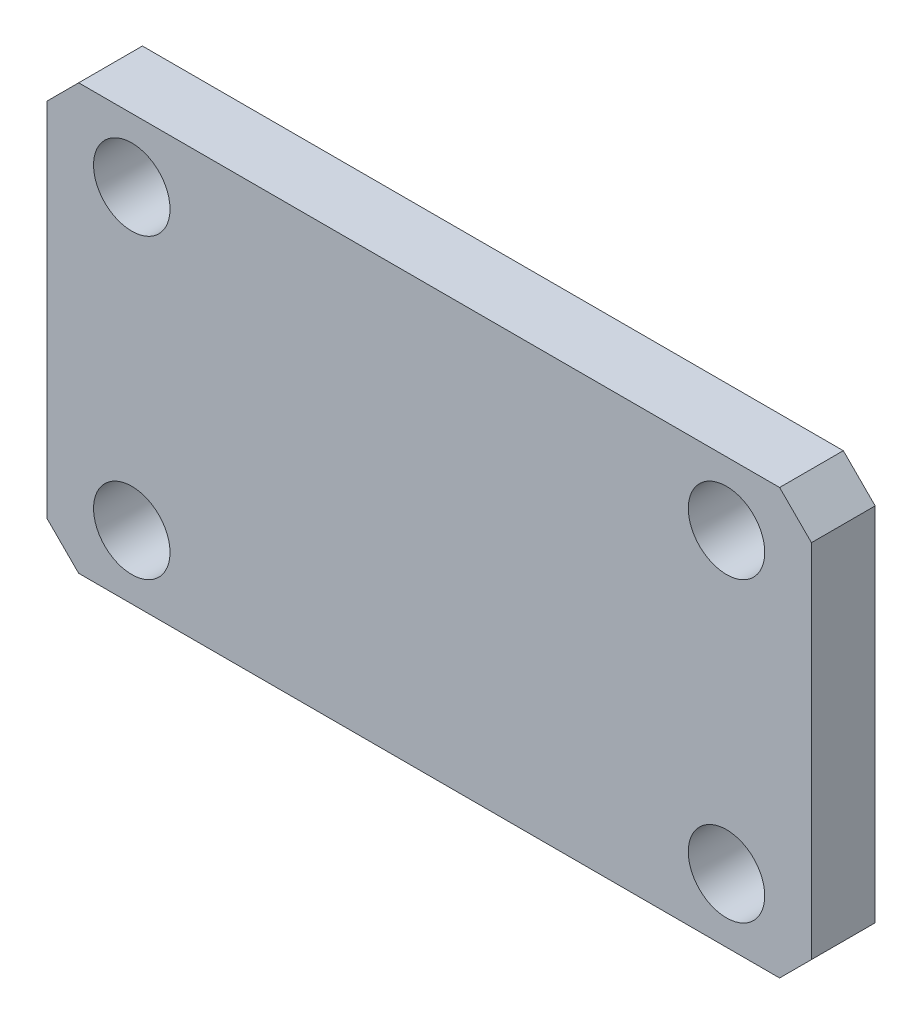
ISO-10303-21;
HEADER;
FILE_DESCRIPTION(('STEP AP214'),'2;1');
FILE_NAME('part.step','',(''),(''),'','','');
FILE_SCHEMA(('AUTOMOTIVE_DESIGN { 1 0 10303 214 1 1 1 1 }'));
ENDSEC;
DATA;
#1=APPLICATION_CONTEXT('core data for automotive mechanical design processes');
#2=APPLICATION_PROTOCOL_DEFINITION('international standard','automotive_design',2000,#1);
#3=PRODUCT_CONTEXT('',#1,'mechanical');
#4=PRODUCT('Part','Part','',(#3));
#5=PRODUCT_RELATED_PRODUCT_CATEGORY('part','',(#4));
#6=PRODUCT_DEFINITION_FORMATION('','',#4);
#7=PRODUCT_DEFINITION_CONTEXT('part definition',#1,'design');
#8=PRODUCT_DEFINITION('design','',#6,#7);
#9=PRODUCT_DEFINITION_SHAPE('','',#8);
#10=(LENGTH_UNIT() NAMED_UNIT(*) SI_UNIT(.MILLI.,.METRE.));
#11=(NAMED_UNIT(*) PLANE_ANGLE_UNIT() SI_UNIT($,.RADIAN.));
#12=(NAMED_UNIT(*) SI_UNIT($,.STERADIAN.) SOLID_ANGLE_UNIT());
#13=UNCERTAINTY_MEASURE_WITH_UNIT(LENGTH_MEASURE(1.E-05),#10,'distance_accuracy_value','');
#14=(GEOMETRIC_REPRESENTATION_CONTEXT(3) GLOBAL_UNCERTAINTY_ASSIGNED_CONTEXT((#13)) GLOBAL_UNIT_ASSIGNED_CONTEXT((#10,
#11,#12)) REPRESENTATION_CONTEXT('',''));
#15=CARTESIAN_POINT('',(0.,0.,0.));
#16=DIRECTION('',(0.,0.,1.));
#17=DIRECTION('',(1.,0.,0.));
#18=AXIS2_PLACEMENT_3D('',#15,#16,#17);
#19=CARTESIAN_POINT('',(27.,0.,-0.5));
#20=DIRECTION('',(-1.,0.,0.));
#21=DIRECTION('',(0.,0.,1.));
#22=AXIS2_PLACEMENT_3D('',#19,#20,#21);
#23=PLANE('',#22);
#24=DIRECTION('',(0.,-1.,0.));
#25=VECTOR('',#24,1.);
#26=CARTESIAN_POINT('',(27.,0.,0.5));
#27=LINE('',#26,#25);
#28=CARTESIAN_POINT('',(27.,15.,0.5));
#29=VERTEX_POINT('',#28);
#30=CARTESIAN_POINT('',(27.,5.,0.5));
#31=VERTEX_POINT('',#30);
#32=EDGE_CURVE('E116',#29,#31,#27,.T.);
#33=ORIENTED_EDGE('',*,*,#32,.T.);
#34=DIRECTION('',(0.,0.,1.));
#35=VECTOR('',#34,1.);
#36=CARTESIAN_POINT('',(27.,5.,-0.5));
#37=LINE('',#36,#35);
#38=CARTESIAN_POINT('',(27.,5.,-0.5));
#39=VERTEX_POINT('',#38);
#40=EDGE_CURVE('E12',#39,#31,#37,.T.);
#41=ORIENTED_EDGE('',*,*,#40,.F.);
#42=DIRECTION('',(0.,-1.,0.));
#43=VECTOR('',#42,1.);
#44=CARTESIAN_POINT('',(27.,0.,-0.5));
#45=LINE('',#44,#43);
#46=CARTESIAN_POINT('',(27.,15.,-0.5));
#47=VERTEX_POINT('',#46);
#48=EDGE_CURVE('E104',#47,#39,#45,.T.);
#49=ORIENTED_EDGE('',*,*,#48,.F.);
#50=DIRECTION('',(0.,0.,1.));
#51=VECTOR('',#50,1.);
#52=CARTESIAN_POINT('',(27.,15.,-0.5));
#53=LINE('',#52,#51);
#54=EDGE_CURVE('E112',#47,#29,#53,.T.);
#55=ORIENTED_EDGE('',*,*,#54,.T.);
#56=EDGE_LOOP('',(#33,#41,#49,#55));
#57=FACE_BOUND('',#56,.T.);
#58=ADVANCED_FACE('F53',(#57),#23,.F.);
#59=CARTESIAN_POINT('',(0.,5.,-0.5));
#60=DIRECTION('',(0.,1.,0.));
#61=DIRECTION('',(0.,0.,1.));
#62=AXIS2_PLACEMENT_3D('',#59,#60,#61);
#63=PLANE('',#62);
#64=DIRECTION('',(-1.,0.,0.));
#65=VECTOR('',#64,1.);
#66=CARTESIAN_POINT('',(0.,5.,0.5));
#67=LINE('',#66,#65);
#68=CARTESIAN_POINT('',(9.00000000000001,5.,0.5));
#69=VERTEX_POINT('',#68);
#70=EDGE_CURVE('E108',#31,#69,#67,.T.);
#71=ORIENTED_EDGE('',*,*,#70,.T.);
#72=DIRECTION('',(0.,0.,1.));
#73=VECTOR('',#72,1.);
#74=CARTESIAN_POINT('',(9.00000000000001,5.,-0.5));
#75=LINE('',#74,#73);
#76=CARTESIAN_POINT('',(9.00000000000001,5.,-0.5));
#77=VERTEX_POINT('',#76);
#78=EDGE_CURVE('E61',#77,#69,#75,.T.);
#79=ORIENTED_EDGE('',*,*,#78,.F.);
#80=DIRECTION('',(-1.,0.,0.));
#81=VECTOR('',#80,1.);
#82=CARTESIAN_POINT('',(0.,5.,-0.5));
#83=LINE('',#82,#81);
#84=EDGE_CURVE('E99',#39,#77,#83,.T.);
#85=ORIENTED_EDGE('',*,*,#84,.F.);
#86=ORIENTED_EDGE('',*,*,#40,.T.);
#87=EDGE_LOOP('',(#71,#79,#85,#86));
#88=FACE_BOUND('',#87,.T.);
#89=ADVANCED_FACE('F107',(#88),#63,.F.);
#90=CARTESIAN_POINT('',(9.00000000000001,0.,-0.5));
#91=DIRECTION('',(1.,0.,0.));
#92=DIRECTION('',(0.,0.,-1.));
#93=AXIS2_PLACEMENT_3D('',#90,#91,#92);
#94=PLANE('',#93);
#95=DIRECTION('',(0.,1.,0.));
#96=VECTOR('',#95,1.);
#97=CARTESIAN_POINT('',(9.00000000000001,0.,0.5));
#98=LINE('',#97,#96);
#99=CARTESIAN_POINT('',(9.00000000000001,15.,0.5));
#100=VERTEX_POINT('',#99);
#101=EDGE_CURVE('E86',#69,#100,#98,.T.);
#102=ORIENTED_EDGE('',*,*,#101,.T.);
#103=DIRECTION('',(0.,0.,1.));
#104=VECTOR('',#103,1.);
#105=CARTESIAN_POINT('',(9.00000000000001,15.,-0.5));
#106=LINE('',#105,#104);
#107=CARTESIAN_POINT('',(9.00000000000001,15.,-0.5));
#108=VERTEX_POINT('',#107);
#109=EDGE_CURVE('E109',#108,#100,#106,.T.);
#110=ORIENTED_EDGE('',*,*,#109,.F.);
#111=DIRECTION('',(0.,1.,0.));
#112=VECTOR('',#111,1.);
#113=CARTESIAN_POINT('',(9.00000000000001,0.,-0.5));
#114=LINE('',#113,#112);
#115=EDGE_CURVE('E102',#77,#108,#114,.T.);
#116=ORIENTED_EDGE('',*,*,#115,.F.);
#117=ORIENTED_EDGE('',*,*,#78,.T.);
#118=EDGE_LOOP('',(#102,#110,#116,#117));
#119=FACE_BOUND('',#118,.T.);
#120=ADVANCED_FACE('F110',(#119),#94,.F.);
#121=CARTESIAN_POINT('',(0.,15.,-0.5));
#122=DIRECTION('',(0.,-1.,0.));
#123=DIRECTION('',(0.,0.,-1.));
#124=AXIS2_PLACEMENT_3D('',#121,#122,#123);
#125=PLANE('',#124);
#126=DIRECTION('',(1.,0.,0.));
#127=VECTOR('',#126,1.);
#128=CARTESIAN_POINT('',(0.,15.,0.5));
#129=LINE('',#128,#127);
#130=EDGE_CURVE('E92',#100,#29,#129,.T.);
#131=ORIENTED_EDGE('',*,*,#130,.T.);
#132=ORIENTED_EDGE('',*,*,#54,.F.);
#133=DIRECTION('',(1.,0.,0.));
#134=VECTOR('',#133,1.);
#135=CARTESIAN_POINT('',(0.,15.,-0.5));
#136=LINE('',#135,#134);
#137=EDGE_CURVE('E69',#108,#47,#136,.T.);
#138=ORIENTED_EDGE('',*,*,#137,.F.);
#139=ORIENTED_EDGE('',*,*,#109,.T.);
#140=EDGE_LOOP('',(#131,#132,#138,#139));
#141=FACE_BOUND('',#140,.T.);
#142=ADVANCED_FACE('F123',(#141),#125,.F.);
#143=CARTESIAN_POINT('',(0.,0.,-0.5));
#144=DIRECTION('',(0.,0.,-1.));
#145=DIRECTION('',(-1.,0.,0.));
#146=AXIS2_PLACEMENT_3D('',#143,#144,#145);
#147=PLANE('',#146);
#148=ORIENTED_EDGE('',*,*,#48,.T.);
#149=ORIENTED_EDGE('',*,*,#84,.T.);
#150=ORIENTED_EDGE('',*,*,#115,.T.);
#151=ORIENTED_EDGE('',*,*,#137,.T.);
#152=EDGE_LOOP('',(#148,#149,#150,#151));
#153=FACE_BOUND('',#152,.T.);
#154=ADVANCED_FACE('F100',(#153),#147,.T.);
#155=CARTESIAN_POINT('',(0.,0.,0.5));
#156=DIRECTION('',(0.,0.,-1.));
#157=DIRECTION('',(-1.,0.,0.));
#158=AXIS2_PLACEMENT_3D('',#155,#156,#157);
#159=PLANE('',#158);
#160=ORIENTED_EDGE('',*,*,#32,.F.);
#161=ORIENTED_EDGE('',*,*,#130,.F.);
#162=ORIENTED_EDGE('',*,*,#101,.F.);
#163=ORIENTED_EDGE('',*,*,#70,.F.);
#164=EDGE_LOOP('',(#160,#161,#162,#163));
#165=FACE_BOUND('',#164,.T.);
#166=ADVANCED_FACE('F126',(#165),#159,.F.);
#167=CLOSED_SHELL('',(#58,#89,#120,#142,#154,#166));
#168=MANIFOLD_SOLID_BREP('B2',#167);
#169=CARTESIAN_POINT('',(0.,0.,0.));
#170=DIRECTION('',(0.,0.,-1.));
#171=DIRECTION('',(-1.,0.,0.));
#172=AXIS2_PLACEMENT_3D('',#169,#170,#171);
#173=PLANE('',#172);
#174=CARTESIAN_POINT('',(3.99999999999993,17.,0.));
#175=DIRECTION('',(0.,0.,-1.));
#176=DIRECTION('',(-1.,0.,0.));
#177=AXIS2_PLACEMENT_3D('',#174,#175,#176);
#178=CIRCLE('',#177,1.8);
#179=CARTESIAN_POINT('',(2.19999999999993,17.,0.));
#180=VERTEX_POINT('',#179);
#181=EDGE_CURVE('E280',#180,#180,#178,.T.);
#182=ORIENTED_EDGE('',*,*,#181,.F.);
#183=EDGE_LOOP('',(#182));
#184=FACE_BOUND('',#183,.T.);
#185=CARTESIAN_POINT('',(31.9999999999999,17.,0.));
#186=DIRECTION('',(0.,0.,-1.));
#187=DIRECTION('',(-1.,0.,0.));
#188=AXIS2_PLACEMENT_3D('',#185,#186,#187);
#189=CIRCLE('',#188,1.8);
#190=CARTESIAN_POINT('',(30.1999999999999,17.,0.));
#191=VERTEX_POINT('',#190);
#192=EDGE_CURVE('E289',#191,#191,#189,.T.);
#193=ORIENTED_EDGE('',*,*,#192,.F.);
#194=EDGE_LOOP('',(#193));
#195=FACE_BOUND('',#194,.T.);
#196=CARTESIAN_POINT('',(32.0000000000001,3.,0.));
#197=DIRECTION('',(0.,0.,-1.));
#198=DIRECTION('',(-1.,0.,0.));
#199=AXIS2_PLACEMENT_3D('',#196,#197,#198);
#200=CIRCLE('',#199,1.8);
#201=CARTESIAN_POINT('',(30.2000000000001,3.,0.));
#202=VERTEX_POINT('',#201);
#203=EDGE_CURVE('E295',#202,#202,#200,.T.);
#204=ORIENTED_EDGE('',*,*,#203,.F.);
#205=EDGE_LOOP('',(#204));
#206=FACE_BOUND('',#205,.T.);
#207=CARTESIAN_POINT('',(4.00000000000007,3.,0.));
#208=DIRECTION('',(0.,0.,-1.));
#209=DIRECTION('',(-1.,0.,0.));
#210=AXIS2_PLACEMENT_3D('',#207,#208,#209);
#211=CIRCLE('',#210,1.8);
#212=CARTESIAN_POINT('',(2.20000000000007,3.,0.));
#213=VERTEX_POINT('',#212);
#214=EDGE_CURVE('E299',#213,#213,#211,.T.);
#215=ORIENTED_EDGE('',*,*,#214,.F.);
#216=EDGE_LOOP('',(#215));
#217=FACE_BOUND('',#216,.T.);
#218=DIRECTION('',(-1.,0.,0.));
#219=VECTOR('',#218,1.);
#220=CARTESIAN_POINT('',(0.,20.,0.));
#221=LINE('',#220,#219);
#222=CARTESIAN_POINT('',(34.5,20.,0.));
#223=VERTEX_POINT('',#222);
#224=CARTESIAN_POINT('',(1.50000000000001,20.,0.));
#225=VERTEX_POINT('',#224);
#226=EDGE_CURVE('E307',#223,#225,#221,.T.);
#227=ORIENTED_EDGE('',*,*,#226,.F.);
#228=DIRECTION('',(-0.707106781186544,0.707106781186551,0.));
#229=VECTOR('',#228,1.);
#230=CARTESIAN_POINT('',(27.2500000000002,27.2499999999999,0.));
#231=LINE('',#230,#229);
#232=CARTESIAN_POINT('',(36.,18.5,0.));
#233=VERTEX_POINT('',#232);
#234=EDGE_CURVE('E339',#223,#233,#231,.F.);
#235=ORIENTED_EDGE('',*,*,#234,.T.);
#236=DIRECTION('',(0.,1.,0.));
#237=VECTOR('',#236,1.);
#238=CARTESIAN_POINT('',(36.,0.,0.));
#239=LINE('',#238,#237);
#240=CARTESIAN_POINT('',(36.,1.5,0.));
#241=VERTEX_POINT('',#240);
#242=EDGE_CURVE('E320',#241,#233,#239,.T.);
#243=ORIENTED_EDGE('',*,*,#242,.F.);
#244=DIRECTION('',(0.707106781186548,0.707106781186548,0.));
#245=VECTOR('',#244,1.);
#246=CARTESIAN_POINT('',(17.25,-17.25,0.));
#247=LINE('',#246,#245);
#248=CARTESIAN_POINT('',(34.5,0.,0.));
#249=VERTEX_POINT('',#248);
#250=EDGE_CURVE('E337',#241,#249,#247,.F.);
#251=ORIENTED_EDGE('',*,*,#250,.T.);
#252=DIRECTION('',(1.,0.,0.));
#253=VECTOR('',#252,1.);
#254=CARTESIAN_POINT('',(0.,0.,0.));
#255=LINE('',#254,#253);
#256=CARTESIAN_POINT('',(1.5,0.,0.));
#257=VERTEX_POINT('',#256);
#258=EDGE_CURVE('E318',#257,#249,#255,.T.);
#259=ORIENTED_EDGE('',*,*,#258,.F.);
#260=DIRECTION('',(0.707106781186547,-0.707106781186548,0.));
#261=VECTOR('',#260,1.);
#262=CARTESIAN_POINT('',(0.750000000000002,0.750000000000001,0.));
#263=LINE('',#262,#261);
#264=CARTESIAN_POINT('',(0.,1.5,0.));
#265=VERTEX_POINT('',#264);
#266=EDGE_CURVE('E335',#257,#265,#263,.F.);
#267=ORIENTED_EDGE('',*,*,#266,.T.);
#268=DIRECTION('',(0.,-1.,0.));
#269=VECTOR('',#268,1.);
#270=CARTESIAN_POINT('',(0.,0.,0.));
#271=LINE('',#270,#269);
#272=CARTESIAN_POINT('',(0.,18.5,0.));
#273=VERTEX_POINT('',#272);
#274=EDGE_CURVE('E302',#273,#265,#271,.T.);
#275=ORIENTED_EDGE('',*,*,#274,.F.);
#276=DIRECTION('',(-0.70710678118655,-0.707106781186545,0.));
#277=VECTOR('',#276,1.);
#278=CARTESIAN_POINT('',(-9.25,9.25000000000006,0.));
#279=LINE('',#278,#277);
#280=EDGE_CURVE('E333',#273,#225,#279,.F.);
#281=ORIENTED_EDGE('',*,*,#280,.T.);
#282=EDGE_LOOP('',(#227,#235,#243,#251,#259,#267,#275,#281));
#283=FACE_BOUND('',#282,.T.);
#284=DIRECTION('',(-1.,0.,0.));
#285=VECTOR('',#284,1.);
#286=CARTESIAN_POINT('',(8.00000000000001,16.,0.));
#287=LINE('',#286,#285);
#288=CARTESIAN_POINT('',(28.,16.,0.));
#289=VERTEX_POINT('',#288);
#290=CARTESIAN_POINT('',(8.00000000000001,16.,0.));
#291=VERTEX_POINT('',#290);
#292=EDGE_CURVE('E271',#289,#291,#287,.T.);
#293=ORIENTED_EDGE('',*,*,#292,.T.);
#294=DIRECTION('',(0.,-1.,0.));
#295=VECTOR('',#294,1.);
#296=CARTESIAN_POINT('',(8.00000000000001,16.,0.));
#297=LINE('',#296,#295);
#298=CARTESIAN_POINT('',(8.00000000000001,4.,0.));
#299=VERTEX_POINT('',#298);
#300=EDGE_CURVE('E181',#291,#299,#297,.T.);
#301=ORIENTED_EDGE('',*,*,#300,.T.);
#302=DIRECTION('',(1.,0.,0.));
#303=VECTOR('',#302,1.);
#304=CARTESIAN_POINT('',(8.00000000000001,4.,0.));
#305=LINE('',#304,#303);
#306=CARTESIAN_POINT('',(28.,4.,0.));
#307=VERTEX_POINT('',#306);
#308=EDGE_CURVE('E275',#299,#307,#305,.T.);
#309=ORIENTED_EDGE('',*,*,#308,.T.);
#310=DIRECTION('',(0.,1.,0.));
#311=VECTOR('',#310,1.);
#312=CARTESIAN_POINT('',(28.,16.,0.));
#313=LINE('',#312,#311);
#314=EDGE_CURVE('E553',#307,#289,#313,.T.);
#315=ORIENTED_EDGE('',*,*,#314,.T.);
#316=EDGE_LOOP('',(#293,#301,#309,#315));
#317=FACE_BOUND('',#316,.T.);
#318=ADVANCED_FACE('F165',(#184,#195,#206,#217,#283,#317),#173,.T.);
#319=CARTESIAN_POINT('',(0.,0.,3.));
#320=DIRECTION('',(1.,0.,0.));
#321=DIRECTION('',(0.,0.,-1.));
#322=AXIS2_PLACEMENT_3D('',#319,#320,#321);
#323=PLANE('',#322);
#324=ORIENTED_EDGE('',*,*,#274,.T.);
#325=DIRECTION('',(0.,0.,1.));
#326=VECTOR('',#325,1.);
#327=CARTESIAN_POINT('',(0.,1.5,3.));
#328=LINE('',#327,#326);
#329=CARTESIAN_POINT('',(0.,1.5,3.));
#330=VERTEX_POINT('',#329);
#331=EDGE_CURVE('E51',#265,#330,#328,.T.);
#332=ORIENTED_EDGE('',*,*,#331,.T.);
#333=DIRECTION('',(0.,-1.,0.));
#334=VECTOR('',#333,1.);
#335=CARTESIAN_POINT('',(0.,0.,3.));
#336=LINE('',#335,#334);
#337=CARTESIAN_POINT('',(0.,18.5,3.));
#338=VERTEX_POINT('',#337);
#339=EDGE_CURVE('E303',#338,#330,#336,.T.);
#340=ORIENTED_EDGE('',*,*,#339,.F.);
#341=DIRECTION('',(0.,0.,-1.));
#342=VECTOR('',#341,1.);
#343=CARTESIAN_POINT('',(0.,18.5,3.));
#344=LINE('',#343,#342);
#345=EDGE_CURVE('E174',#338,#273,#344,.T.);
#346=ORIENTED_EDGE('',*,*,#345,.T.);
#347=EDGE_LOOP('',(#324,#332,#340,#346));
#348=FACE_BOUND('',#347,.T.);
#349=ADVANCED_FACE('F362',(#348),#323,.F.);
#350=CARTESIAN_POINT('',(0.,0.,3.));
#351=DIRECTION('',(0.,1.,0.));
#352=DIRECTION('',(0.,0.,1.));
#353=AXIS2_PLACEMENT_3D('',#350,#351,#352);
#354=PLANE('',#353);
#355=ORIENTED_EDGE('',*,*,#258,.T.);
#356=DIRECTION('',(0.,0.,1.));
#357=VECTOR('',#356,1.);
#358=CARTESIAN_POINT('',(34.5,0.,3.));
#359=LINE('',#358,#357);
#360=CARTESIAN_POINT('',(34.5,0.,3.));
#361=VERTEX_POINT('',#360);
#362=EDGE_CURVE('E189',#249,#361,#359,.T.);
#363=ORIENTED_EDGE('',*,*,#362,.T.);
#364=DIRECTION('',(1.,0.,0.));
#365=VECTOR('',#364,1.);
#366=CARTESIAN_POINT('',(0.,0.,3.));
#367=LINE('',#366,#365);
#368=CARTESIAN_POINT('',(1.5,0.,3.));
#369=VERTEX_POINT('',#368);
#370=EDGE_CURVE('E306',#369,#361,#367,.T.);
#371=ORIENTED_EDGE('',*,*,#370,.F.);
#372=DIRECTION('',(0.,0.,-1.));
#373=VECTOR('',#372,1.);
#374=CARTESIAN_POINT('',(1.5,0.,3.));
#375=LINE('',#374,#373);
#376=EDGE_CURVE('E354',#369,#257,#375,.T.);
#377=ORIENTED_EDGE('',*,*,#376,.T.);
#378=EDGE_LOOP('',(#355,#363,#371,#377));
#379=FACE_BOUND('',#378,.T.);
#380=ADVANCED_FACE('F374',(#379),#354,.F.);
#381=CARTESIAN_POINT('',(36.,0.,3.));
#382=DIRECTION('',(-1.,0.,0.));
#383=DIRECTION('',(0.,0.,1.));
#384=AXIS2_PLACEMENT_3D('',#381,#382,#383);
#385=PLANE('',#384);
#386=ORIENTED_EDGE('',*,*,#242,.T.);
#387=DIRECTION('',(0.,0.,1.));
#388=VECTOR('',#387,1.);
#389=CARTESIAN_POINT('',(36.,18.5,3.));
#390=LINE('',#389,#388);
#391=CARTESIAN_POINT('',(36.,18.5,3.));
#392=VERTEX_POINT('',#391);
#393=EDGE_CURVE('E344',#233,#392,#390,.T.);
#394=ORIENTED_EDGE('',*,*,#393,.T.);
#395=DIRECTION('',(0.,1.,0.));
#396=VECTOR('',#395,1.);
#397=CARTESIAN_POINT('',(36.,0.,3.));
#398=LINE('',#397,#396);
#399=CARTESIAN_POINT('',(36.,1.5,3.));
#400=VERTEX_POINT('',#399);
#401=EDGE_CURVE('E309',#400,#392,#398,.T.);
#402=ORIENTED_EDGE('',*,*,#401,.F.);
#403=DIRECTION('',(0.,0.,-1.));
#404=VECTOR('',#403,1.);
#405=CARTESIAN_POINT('',(36.,1.5,3.));
#406=LINE('',#405,#404);
#407=EDGE_CURVE('E341',#400,#241,#406,.T.);
#408=ORIENTED_EDGE('',*,*,#407,.T.);
#409=EDGE_LOOP('',(#386,#394,#402,#408));
#410=FACE_BOUND('',#409,.T.);
#411=ADVANCED_FACE('F384',(#410),#385,.F.);
#412=CARTESIAN_POINT('',(0.,20.,3.));
#413=DIRECTION('',(0.,-1.,0.));
#414=DIRECTION('',(0.,0.,-1.));
#415=AXIS2_PLACEMENT_3D('',#412,#413,#414);
#416=PLANE('',#415);
#417=DIRECTION('',(-1.,0.,0.));
#418=VECTOR('',#417,1.);
#419=CARTESIAN_POINT('',(0.,20.,3.));
#420=LINE('',#419,#418);
#421=CARTESIAN_POINT('',(34.5,20.,3.));
#422=VERTEX_POINT('',#421);
#423=CARTESIAN_POINT('',(1.50000000000001,20.,3.));
#424=VERTEX_POINT('',#423);
#425=EDGE_CURVE('E312',#422,#424,#420,.T.);
#426=ORIENTED_EDGE('',*,*,#425,.F.);
#427=DIRECTION('',(0.,0.,-1.));
#428=VECTOR('',#427,1.);
#429=CARTESIAN_POINT('',(34.5,20.,3.));
#430=LINE('',#429,#428);
#431=EDGE_CURVE('E330',#422,#223,#430,.T.);
#432=ORIENTED_EDGE('',*,*,#431,.T.);
#433=ORIENTED_EDGE('',*,*,#226,.T.);
#434=DIRECTION('',(0.,0.,1.));
#435=VECTOR('',#434,1.);
#436=CARTESIAN_POINT('',(1.50000000000001,20.,3.));
#437=LINE('',#436,#435);
#438=EDGE_CURVE('E315',#225,#424,#437,.T.);
#439=ORIENTED_EDGE('',*,*,#438,.T.);
#440=EDGE_LOOP('',(#426,#432,#433,#439));
#441=FACE_BOUND('',#440,.T.);
#442=ADVANCED_FACE('F392',(#441),#416,.F.);
#443=CARTESIAN_POINT('',(0.,0.,3.));
#444=DIRECTION('',(0.,0.,-1.));
#445=DIRECTION('',(-1.,0.,0.));
#446=AXIS2_PLACEMENT_3D('',#443,#444,#445);
#447=PLANE('',#446);
#448=CARTESIAN_POINT('',(3.99999999999993,17.,3.));
#449=DIRECTION('',(0.,0.,1.));
#450=DIRECTION('',(1.,0.,0.));
#451=AXIS2_PLACEMENT_3D('',#448,#449,#450);
#452=CIRCLE('',#451,1.8);
#453=CARTESIAN_POINT('',(5.79999999999992,17.,3.));
#454=VERTEX_POINT('',#453);
#455=EDGE_CURVE('E276',#454,#454,#452,.T.);
#456=ORIENTED_EDGE('',*,*,#455,.F.);
#457=EDGE_LOOP('',(#456));
#458=FACE_BOUND('',#457,.T.);
#459=CARTESIAN_POINT('',(31.9999999999999,17.,3.));
#460=DIRECTION('',(0.,0.,1.));
#461=DIRECTION('',(1.,0.,0.));
#462=AXIS2_PLACEMENT_3D('',#459,#460,#461);
#463=CIRCLE('',#462,1.8);
#464=CARTESIAN_POINT('',(33.7999999999999,17.,3.));
#465=VERTEX_POINT('',#464);
#466=EDGE_CURVE('E286',#465,#465,#463,.T.);
#467=ORIENTED_EDGE('',*,*,#466,.F.);
#468=EDGE_LOOP('',(#467));
#469=FACE_BOUND('',#468,.T.);
#470=CARTESIAN_POINT('',(32.0000000000001,3.,3.));
#471=DIRECTION('',(0.,0.,1.));
#472=DIRECTION('',(1.,0.,0.));
#473=AXIS2_PLACEMENT_3D('',#470,#471,#472);
#474=CIRCLE('',#473,1.8);
#475=CARTESIAN_POINT('',(33.8000000000001,3.,3.));
#476=VERTEX_POINT('',#475);
#477=EDGE_CURVE('E292',#476,#476,#474,.T.);
#478=ORIENTED_EDGE('',*,*,#477,.F.);
#479=EDGE_LOOP('',(#478));
#480=FACE_BOUND('',#479,.T.);
#481=CARTESIAN_POINT('',(4.00000000000007,3.,3.));
#482=DIRECTION('',(0.,0.,1.));
#483=DIRECTION('',(1.,0.,0.));
#484=AXIS2_PLACEMENT_3D('',#481,#482,#483);
#485=CIRCLE('',#484,1.8);
#486=CARTESIAN_POINT('',(5.80000000000007,3.,3.));
#487=VERTEX_POINT('',#486);
#488=EDGE_CURVE('E296',#487,#487,#485,.T.);
#489=ORIENTED_EDGE('',*,*,#488,.F.);
#490=EDGE_LOOP('',(#489));
#491=FACE_BOUND('',#490,.T.);
#492=ORIENTED_EDGE('',*,*,#401,.T.);
#493=DIRECTION('',(0.707106781186544,-0.707106781186551,0.));
#494=VECTOR('',#493,1.);
#495=CARTESIAN_POINT('',(34.5,20.,3.));
#496=LINE('',#495,#494);
#497=EDGE_CURVE('E352',#392,#422,#496,.F.);
#498=ORIENTED_EDGE('',*,*,#497,.T.);
#499=ORIENTED_EDGE('',*,*,#425,.T.);
#500=DIRECTION('',(0.70710678118655,0.707106781186545,0.));
#501=VECTOR('',#500,1.);
#502=CARTESIAN_POINT('',(0.,18.5,3.));
#503=LINE('',#502,#501);
#504=EDGE_CURVE('E346',#424,#338,#503,.F.);
#505=ORIENTED_EDGE('',*,*,#504,.T.);
#506=ORIENTED_EDGE('',*,*,#339,.T.);
#507=DIRECTION('',(-0.707106781186547,0.707106781186548,0.));
#508=VECTOR('',#507,1.);
#509=CARTESIAN_POINT('',(1.5,0.,3.));
#510=LINE('',#509,#508);
#511=EDGE_CURVE('E348',#330,#369,#510,.F.);
#512=ORIENTED_EDGE('',*,*,#511,.T.);
#513=ORIENTED_EDGE('',*,*,#370,.T.);
#514=DIRECTION('',(-0.707106781186548,-0.707106781186548,0.));
#515=VECTOR('',#514,1.);
#516=CARTESIAN_POINT('',(36.,1.5,3.));
#517=LINE('',#516,#515);
#518=EDGE_CURVE('E350',#361,#400,#517,.F.);
#519=ORIENTED_EDGE('',*,*,#518,.T.);
#520=EDGE_LOOP('',(#492,#498,#499,#505,#506,#512,#513,#519));
#521=FACE_BOUND('',#520,.T.);
#522=ADVANCED_FACE('F377',(#458,#469,#480,#491,#521),#447,.F.);
#523=CARTESIAN_POINT('',(4.00000000000007,3.,3.));
#524=DIRECTION('',(0.,0.,1.));
#525=DIRECTION('',(1.,0.,0.));
#526=AXIS2_PLACEMENT_3D('',#523,#524,#525);
#527=CYLINDRICAL_SURFACE('',#526,1.8);
#528=ORIENTED_EDGE('',*,*,#214,.T.);
#529=EDGE_LOOP('',(#528));
#530=FACE_BOUND('',#529,.T.);
#531=ORIENTED_EDGE('',*,*,#488,.T.);
#532=EDGE_LOOP('',(#531));
#533=FACE_BOUND('',#532,.T.);
#534=ADVANCED_FACE('F490',(#530,#533),#527,.F.);
#535=CARTESIAN_POINT('',(32.0000000000001,3.,3.));
#536=DIRECTION('',(0.,0.,1.));
#537=DIRECTION('',(1.,0.,0.));
#538=AXIS2_PLACEMENT_3D('',#535,#536,#537);
#539=CYLINDRICAL_SURFACE('',#538,1.8);
#540=ORIENTED_EDGE('',*,*,#203,.T.);
#541=EDGE_LOOP('',(#540));
#542=FACE_BOUND('',#541,.T.);
#543=ORIENTED_EDGE('',*,*,#477,.T.);
#544=EDGE_LOOP('',(#543));
#545=FACE_BOUND('',#544,.T.);
#546=ADVANCED_FACE('F487',(#542,#545),#539,.F.);
#547=CARTESIAN_POINT('',(31.9999999999999,17.,3.));
#548=DIRECTION('',(0.,0.,1.));
#549=DIRECTION('',(1.,0.,0.));
#550=AXIS2_PLACEMENT_3D('',#547,#548,#549);
#551=CYLINDRICAL_SURFACE('',#550,1.8);
#552=ORIENTED_EDGE('',*,*,#192,.T.);
#553=EDGE_LOOP('',(#552));
#554=FACE_BOUND('',#553,.T.);
#555=ORIENTED_EDGE('',*,*,#466,.T.);
#556=EDGE_LOOP('',(#555));
#557=FACE_BOUND('',#556,.T.);
#558=ADVANCED_FACE('F483',(#554,#557),#551,.F.);
#559=CARTESIAN_POINT('',(3.99999999999993,17.,3.));
#560=DIRECTION('',(0.,0.,1.));
#561=DIRECTION('',(1.,0.,0.));
#562=AXIS2_PLACEMENT_3D('',#559,#560,#561);
#563=CYLINDRICAL_SURFACE('',#562,1.8);
#564=ORIENTED_EDGE('',*,*,#181,.T.);
#565=EDGE_LOOP('',(#564));
#566=FACE_BOUND('',#565,.T.);
#567=ORIENTED_EDGE('',*,*,#455,.T.);
#568=EDGE_LOOP('',(#567));
#569=FACE_BOUND('',#568,.T.);
#570=ADVANCED_FACE('F424',(#566,#569),#563,.F.);
#571=CARTESIAN_POINT('',(34.5,20.,3.));
#572=DIRECTION('',(-0.707106781186551,-0.707106781186544,0.));
#573=DIRECTION('',(0.,0.,-1.));
#574=AXIS2_PLACEMENT_3D('',#571,#572,#573);
#575=PLANE('',#574);
#576=ORIENTED_EDGE('',*,*,#497,.F.);
#577=ORIENTED_EDGE('',*,*,#393,.F.);
#578=ORIENTED_EDGE('',*,*,#234,.F.);
#579=ORIENTED_EDGE('',*,*,#431,.F.);
#580=EDGE_LOOP('',(#576,#577,#578,#579));
#581=FACE_BOUND('',#580,.T.);
#582=ADVANCED_FACE('F389',(#581),#575,.F.);
#583=CARTESIAN_POINT('',(36.,1.5,3.));
#584=DIRECTION('',(-0.707106781186547,0.707106781186547,0.));
#585=DIRECTION('',(0.,0.,-1.));
#586=AXIS2_PLACEMENT_3D('',#583,#584,#585);
#587=PLANE('',#586);
#588=ORIENTED_EDGE('',*,*,#518,.F.);
#589=ORIENTED_EDGE('',*,*,#362,.F.);
#590=ORIENTED_EDGE('',*,*,#250,.F.);
#591=ORIENTED_EDGE('',*,*,#407,.F.);
#592=EDGE_LOOP('',(#588,#589,#590,#591));
#593=FACE_BOUND('',#592,.T.);
#594=ADVANCED_FACE('F381',(#593),#587,.F.);
#595=CARTESIAN_POINT('',(1.5,0.,3.));
#596=DIRECTION('',(0.707106781186548,0.707106781186547,0.));
#597=DIRECTION('',(0.,0.,-1.));
#598=AXIS2_PLACEMENT_3D('',#595,#596,#597);
#599=PLANE('',#598);
#600=ORIENTED_EDGE('',*,*,#511,.F.);
#601=ORIENTED_EDGE('',*,*,#331,.F.);
#602=ORIENTED_EDGE('',*,*,#266,.F.);
#603=ORIENTED_EDGE('',*,*,#376,.F.);
#604=EDGE_LOOP('',(#600,#601,#602,#603));
#605=FACE_BOUND('',#604,.T.);
#606=ADVANCED_FACE('F373',(#605),#599,.F.);
#607=CARTESIAN_POINT('',(0.,18.5,3.));
#608=DIRECTION('',(0.707106781186545,-0.70710678118655,0.));
#609=DIRECTION('',(0.,0.,-1.));
#610=AXIS2_PLACEMENT_3D('',#607,#608,#609);
#611=PLANE('',#610);
#612=ORIENTED_EDGE('',*,*,#504,.F.);
#613=ORIENTED_EDGE('',*,*,#438,.F.);
#614=ORIENTED_EDGE('',*,*,#280,.F.);
#615=ORIENTED_EDGE('',*,*,#345,.F.);
#616=EDGE_LOOP('',(#612,#613,#614,#615));
#617=FACE_BOUND('',#616,.T.);
#618=ADVANCED_FACE('F168',(#617),#611,.F.);
#619=CARTESIAN_POINT('',(8.00000000000001,16.,0.5));
#620=DIRECTION('',(1.,0.,0.));
#621=DIRECTION('',(0.,1.,0.));
#622=AXIS2_PLACEMENT_3D('',#619,#620,#621);
#623=PLANE('',#622);
#624=ORIENTED_EDGE('',*,*,#300,.F.);
#625=DIRECTION('',(0.,0.,-1.));
#626=VECTOR('',#625,1.);
#627=CARTESIAN_POINT('',(8.00000000000001,16.,0.5));
#628=LINE('',#627,#626);
#629=CARTESIAN_POINT('',(8.00000000000001,16.,0.5));
#630=VERTEX_POINT('',#629);
#631=EDGE_CURVE('E270',#630,#291,#628,.T.);
#632=ORIENTED_EDGE('',*,*,#631,.F.);
#633=DIRECTION('',(0.,-1.,0.));
#634=VECTOR('',#633,1.);
#635=CARTESIAN_POINT('',(8.00000000000001,16.,0.5));
#636=LINE('',#635,#634);
#637=CARTESIAN_POINT('',(8.00000000000001,4.,0.5));
#638=VERTEX_POINT('',#637);
#639=EDGE_CURVE('E262',#630,#638,#636,.T.);
#640=ORIENTED_EDGE('',*,*,#639,.T.);
#641=DIRECTION('',(0.,0.,-1.));
#642=VECTOR('',#641,1.);
#643=CARTESIAN_POINT('',(8.00000000000001,4.,0.5));
#644=LINE('',#643,#642);
#645=EDGE_CURVE('E269',#638,#299,#644,.T.);
#646=ORIENTED_EDGE('',*,*,#645,.T.);
#647=EDGE_LOOP('',(#624,#632,#640,#646));
#648=FACE_BOUND('',#647,.T.);
#649=ADVANCED_FACE('F268',(#648),#623,.T.);
#650=CARTESIAN_POINT('',(8.00000000000001,4.,0.5));
#651=DIRECTION('',(0.,1.,0.));
#652=DIRECTION('',(-1.,0.,0.));
#653=AXIS2_PLACEMENT_3D('',#650,#651,#652);
#654=PLANE('',#653);
#655=ORIENTED_EDGE('',*,*,#308,.F.);
#656=ORIENTED_EDGE('',*,*,#645,.F.);
#657=DIRECTION('',(1.,0.,0.));
#658=VECTOR('',#657,1.);
#659=CARTESIAN_POINT('',(8.00000000000001,4.,0.5));
#660=LINE('',#659,#658);
#661=CARTESIAN_POINT('',(28.,4.,0.5));
#662=VERTEX_POINT('',#661);
#663=EDGE_CURVE('E258',#638,#662,#660,.T.);
#664=ORIENTED_EDGE('',*,*,#663,.T.);
#665=DIRECTION('',(0.,0.,-1.));
#666=VECTOR('',#665,1.);
#667=CARTESIAN_POINT('',(28.,4.,0.5));
#668=LINE('',#667,#666);
#669=EDGE_CURVE('E277',#662,#307,#668,.T.);
#670=ORIENTED_EDGE('',*,*,#669,.T.);
#671=EDGE_LOOP('',(#655,#656,#664,#670));
#672=FACE_BOUND('',#671,.T.);
#673=ADVANCED_FACE('F273',(#672),#654,.T.);
#674=CARTESIAN_POINT('',(28.,16.,0.5));
#675=DIRECTION('',(-1.,0.,0.));
#676=DIRECTION('',(0.,0.,1.));
#677=AXIS2_PLACEMENT_3D('',#674,#675,#676);
#678=PLANE('',#677);
#679=ORIENTED_EDGE('',*,*,#314,.F.);
#680=ORIENTED_EDGE('',*,*,#669,.F.);
#681=DIRECTION('',(0.,1.,0.));
#682=VECTOR('',#681,1.);
#683=CARTESIAN_POINT('',(28.,16.,0.5));
#684=LINE('',#683,#682);
#685=CARTESIAN_POINT('',(28.,16.,0.5));
#686=VERTEX_POINT('',#685);
#687=EDGE_CURVE('E263',#662,#686,#684,.T.);
#688=ORIENTED_EDGE('',*,*,#687,.T.);
#689=DIRECTION('',(0.,0.,-1.));
#690=VECTOR('',#689,1.);
#691=CARTESIAN_POINT('',(28.,16.,0.5));
#692=LINE('',#691,#690);
#693=EDGE_CURVE('E282',#686,#289,#692,.T.);
#694=ORIENTED_EDGE('',*,*,#693,.T.);
#695=EDGE_LOOP('',(#679,#680,#688,#694));
#696=FACE_BOUND('',#695,.T.);
#697=ADVANCED_FACE('F457',(#696),#678,.T.);
#698=CARTESIAN_POINT('',(8.00000000000001,16.,0.5));
#699=DIRECTION('',(0.,-1.,0.));
#700=DIRECTION('',(0.,0.,-1.));
#701=AXIS2_PLACEMENT_3D('',#698,#699,#700);
#702=PLANE('',#701);
#703=ORIENTED_EDGE('',*,*,#292,.F.);
#704=ORIENTED_EDGE('',*,*,#693,.F.);
#705=DIRECTION('',(-1.,0.,0.));
#706=VECTOR('',#705,1.);
#707=CARTESIAN_POINT('',(8.00000000000001,16.,0.5));
#708=LINE('',#707,#706);
#709=EDGE_CURVE('E560',#686,#630,#708,.T.);
#710=ORIENTED_EDGE('',*,*,#709,.T.);
#711=ORIENTED_EDGE('',*,*,#631,.T.);
#712=EDGE_LOOP('',(#703,#704,#710,#711));
#713=FACE_BOUND('',#712,.T.);
#714=ADVANCED_FACE('F464',(#713),#702,.T.);
#715=CARTESIAN_POINT('',(0.,0.,0.5));
#716=DIRECTION('',(0.,0.,1.));
#717=DIRECTION('',(1.,0.,0.));
#718=AXIS2_PLACEMENT_3D('',#715,#716,#717);
#719=PLANE('',#718);
#720=ORIENTED_EDGE('',*,*,#639,.F.);
#721=ORIENTED_EDGE('',*,*,#709,.F.);
#722=ORIENTED_EDGE('',*,*,#687,.F.);
#723=ORIENTED_EDGE('',*,*,#663,.F.);
#724=EDGE_LOOP('',(#720,#721,#722,#723));
#725=FACE_BOUND('',#724,.T.);
#726=ADVANCED_FACE('F260',(#725),#719,.F.);
#727=CLOSED_SHELL('',(#318,#349,#380,#411,#442,#522,#534,#546,#558,#570,#582,#594,#606,#618,
#649,#673,#697,#714,#726));
#728=MANIFOLD_SOLID_BREP('B6',#727);
#729=ADVANCED_BREP_SHAPE_REPRESENTATION('',(#18,#168,#728),#14);
#730=SHAPE_DEFINITION_REPRESENTATION(#9,#729);
ENDSEC;
END-ISO-10303-21;
